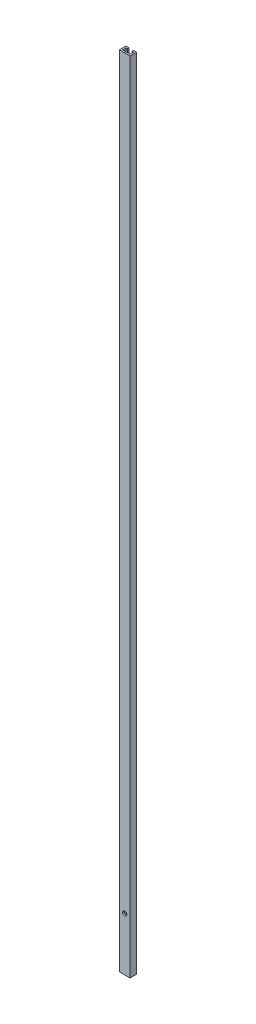
ISO-10303-21;
HEADER;
FILE_DESCRIPTION(('STEP AP214'),'2;1');
FILE_NAME('part.step','',(''),(''),'','','');
FILE_SCHEMA(('AUTOMOTIVE_DESIGN { 1 0 10303 214 1 1 1 1 }'));
ENDSEC;
DATA;
#1=APPLICATION_CONTEXT('core data for automotive mechanical design processes');
#2=APPLICATION_PROTOCOL_DEFINITION('international standard','automotive_design',2000,#1);
#3=PRODUCT_CONTEXT('',#1,'mechanical');
#4=PRODUCT('Part','Part','',(#3));
#5=PRODUCT_RELATED_PRODUCT_CATEGORY('part','',(#4));
#6=PRODUCT_DEFINITION_FORMATION('','',#4);
#7=PRODUCT_DEFINITION_CONTEXT('part definition',#1,'design');
#8=PRODUCT_DEFINITION('design','',#6,#7);
#9=PRODUCT_DEFINITION_SHAPE('','',#8);
#10=(LENGTH_UNIT() NAMED_UNIT(*) SI_UNIT(.MILLI.,.METRE.));
#11=(NAMED_UNIT(*) PLANE_ANGLE_UNIT() SI_UNIT($,.RADIAN.));
#12=(NAMED_UNIT(*) SI_UNIT($,.STERADIAN.) SOLID_ANGLE_UNIT());
#13=UNCERTAINTY_MEASURE_WITH_UNIT(LENGTH_MEASURE(1.E-05),#10,'distance_accuracy_value','');
#14=(GEOMETRIC_REPRESENTATION_CONTEXT(3) GLOBAL_UNCERTAINTY_ASSIGNED_CONTEXT((#13)) GLOBAL_UNIT_ASSIGNED_CONTEXT((#10,
#11,#12)) REPRESENTATION_CONTEXT('',''));
#15=CARTESIAN_POINT('',(0.,0.,0.));
#16=DIRECTION('',(0.,0.,1.));
#17=DIRECTION('',(1.,0.,0.));
#18=AXIS2_PLACEMENT_3D('',#15,#16,#17);
#19=CARTESIAN_POINT('',(0.,600.,0.));
#20=DIRECTION('',(1.,0.,0.));
#21=DIRECTION('',(0.,0.,-1.));
#22=AXIS2_PLACEMENT_3D('',#19,#20,#21);
#23=PLANE('',#22);
#24=DIRECTION('',(0.,0.,1.));
#25=VECTOR('',#24,1.);
#26=CARTESIAN_POINT('',(0.,0.,0.));
#27=LINE('',#26,#25);
#28=CARTESIAN_POINT('',(0.,0.,0.));
#29=VERTEX_POINT('',#28);
#30=CARTESIAN_POINT('',(0.,0.,5.));
#31=VERTEX_POINT('',#30);
#32=EDGE_CURVE('E164',#29,#31,#27,.T.);
#33=ORIENTED_EDGE('',*,*,#32,.T.);
#34=DIRECTION('',(0.,-1.,0.));
#35=VECTOR('',#34,1.);
#36=CARTESIAN_POINT('',(0.,600.,5.));
#37=LINE('',#36,#35);
#38=CARTESIAN_POINT('',(0.,600.,5.));
#39=VERTEX_POINT('',#38);
#40=EDGE_CURVE('E11',#39,#31,#37,.T.);
#41=ORIENTED_EDGE('',*,*,#40,.F.);
#42=DIRECTION('',(0.,0.,1.));
#43=VECTOR('',#42,1.);
#44=CARTESIAN_POINT('',(0.,600.,0.));
#45=LINE('',#44,#43);
#46=CARTESIAN_POINT('',(0.,600.,0.));
#47=VERTEX_POINT('',#46);
#48=EDGE_CURVE('E199',#47,#39,#45,.T.);
#49=ORIENTED_EDGE('',*,*,#48,.F.);
#50=DIRECTION('',(0.,-1.,0.));
#51=VECTOR('',#50,1.);
#52=CARTESIAN_POINT('',(0.,600.,0.));
#53=LINE('',#52,#51);
#54=EDGE_CURVE('E160',#47,#29,#53,.T.);
#55=ORIENTED_EDGE('',*,*,#54,.T.);
#56=EDGE_LOOP('',(#33,#41,#49,#55));
#57=FACE_BOUND('',#56,.T.);
#58=ADVANCED_FACE('F39',(#57),#23,.F.);
#59=CARTESIAN_POINT('',(0.,600.,5.));
#60=DIRECTION('',(0.,0.,-1.));
#61=DIRECTION('',(-1.,0.,0.));
#62=AXIS2_PLACEMENT_3D('',#59,#60,#61);
#63=PLANE('',#62);
#64=CARTESIAN_POINT('',(4.,39.9999999999999,5.));
#65=DIRECTION('',(0.,0.,1.));
#66=DIRECTION('',(1.,0.,0.));
#67=AXIS2_PLACEMENT_3D('',#64,#65,#66);
#68=CIRCLE('',#67,1.6);
#69=CARTESIAN_POINT('',(5.6,39.9999999999999,5.));
#70=VERTEX_POINT('',#69);
#71=EDGE_CURVE('E379',#70,#70,#68,.T.);
#72=ORIENTED_EDGE('',*,*,#71,.F.);
#73=EDGE_LOOP('',(#72));
#74=FACE_BOUND('',#73,.T.);
#75=DIRECTION('',(1.,0.,0.));
#76=VECTOR('',#75,1.);
#77=CARTESIAN_POINT('',(0.,0.,5.));
#78=LINE('',#77,#76);
#79=CARTESIAN_POINT('',(8.,0.,5.));
#80=VERTEX_POINT('',#79);
#81=EDGE_CURVE('E168',#31,#80,#78,.T.);
#82=ORIENTED_EDGE('',*,*,#81,.T.);
#83=DIRECTION('',(0.,-1.,0.));
#84=VECTOR('',#83,1.);
#85=CARTESIAN_POINT('',(8.,600.,5.));
#86=LINE('',#85,#84);
#87=CARTESIAN_POINT('',(8.,600.,5.));
#88=VERTEX_POINT('',#87);
#89=EDGE_CURVE('E48',#88,#80,#86,.T.);
#90=ORIENTED_EDGE('',*,*,#89,.F.);
#91=DIRECTION('',(1.,0.,0.));
#92=VECTOR('',#91,1.);
#93=CARTESIAN_POINT('',(0.,600.,5.));
#94=LINE('',#93,#92);
#95=EDGE_CURVE('E111',#39,#88,#94,.T.);
#96=ORIENTED_EDGE('',*,*,#95,.F.);
#97=ORIENTED_EDGE('',*,*,#40,.T.);
#98=EDGE_LOOP('',(#82,#90,#96,#97));
#99=FACE_BOUND('',#98,.T.);
#100=ADVANCED_FACE('F293',(#74,#99),#63,.F.);
#101=CARTESIAN_POINT('',(8.,600.,5.));
#102=DIRECTION('',(-1.,0.,0.));
#103=DIRECTION('',(0.,0.,1.));
#104=AXIS2_PLACEMENT_3D('',#101,#102,#103);
#105=PLANE('',#104);
#106=DIRECTION('',(0.,0.,-1.));
#107=VECTOR('',#106,1.);
#108=CARTESIAN_POINT('',(8.,0.,5.));
#109=LINE('',#108,#107);
#110=CARTESIAN_POINT('',(8.,0.,0.));
#111=VERTEX_POINT('',#110);
#112=EDGE_CURVE('E172',#80,#111,#109,.T.);
#113=ORIENTED_EDGE('',*,*,#112,.T.);
#114=DIRECTION('',(0.,-1.,0.));
#115=VECTOR('',#114,1.);
#116=CARTESIAN_POINT('',(8.,600.,0.));
#117=LINE('',#116,#115);
#118=CARTESIAN_POINT('',(8.,600.,0.));
#119=VERTEX_POINT('',#118);
#120=EDGE_CURVE('E226',#119,#111,#117,.T.);
#121=ORIENTED_EDGE('',*,*,#120,.F.);
#122=DIRECTION('',(0.,0.,-1.));
#123=VECTOR('',#122,1.);
#124=CARTESIAN_POINT('',(8.,600.,5.));
#125=LINE('',#124,#123);
#126=EDGE_CURVE('E236',#88,#119,#125,.T.);
#127=ORIENTED_EDGE('',*,*,#126,.F.);
#128=ORIENTED_EDGE('',*,*,#89,.T.);
#129=EDGE_LOOP('',(#113,#121,#127,#128));
#130=FACE_BOUND('',#129,.T.);
#131=ADVANCED_FACE('F234',(#130),#105,.F.);
#132=CARTESIAN_POINT('',(8.,600.,0.));
#133=DIRECTION('',(0.,0.,1.));
#134=DIRECTION('',(1.,0.,0.));
#135=AXIS2_PLACEMENT_3D('',#132,#133,#134);
#136=PLANE('',#135);
#137=DIRECTION('',(-1.,0.,0.));
#138=VECTOR('',#137,1.);
#139=CARTESIAN_POINT('',(8.,0.,0.));
#140=LINE('',#139,#138);
#141=CARTESIAN_POINT('',(5.75,0.,0.));
#142=VERTEX_POINT('',#141);
#143=EDGE_CURVE('E175',#111,#142,#140,.T.);
#144=ORIENTED_EDGE('',*,*,#143,.T.);
#145=DIRECTION('',(0.,-1.,0.));
#146=VECTOR('',#145,1.);
#147=CARTESIAN_POINT('',(5.75,600.,0.));
#148=LINE('',#147,#146);
#149=CARTESIAN_POINT('',(5.75,600.,0.));
#150=VERTEX_POINT('',#149);
#151=EDGE_CURVE('E222',#150,#142,#148,.T.);
#152=ORIENTED_EDGE('',*,*,#151,.F.);
#153=DIRECTION('',(-1.,0.,0.));
#154=VECTOR('',#153,1.);
#155=CARTESIAN_POINT('',(8.,600.,0.));
#156=LINE('',#155,#154);
#157=EDGE_CURVE('E255',#119,#150,#156,.T.);
#158=ORIENTED_EDGE('',*,*,#157,.F.);
#159=ORIENTED_EDGE('',*,*,#120,.T.);
#160=EDGE_LOOP('',(#144,#152,#158,#159));
#161=FACE_BOUND('',#160,.T.);
#162=ADVANCED_FACE('F245',(#161),#136,.F.);
#163=CARTESIAN_POINT('',(5.75,600.,0.));
#164=DIRECTION('',(1.,0.,0.));
#165=DIRECTION('',(0.,0.,-1.));
#166=AXIS2_PLACEMENT_3D('',#163,#164,#165);
#167=PLANE('',#166);
#168=DIRECTION('',(0.,0.,1.));
#169=VECTOR('',#168,1.);
#170=CARTESIAN_POINT('',(5.75,0.,0.));
#171=LINE('',#170,#169);
#172=CARTESIAN_POINT('',(5.75,0.,1.15));
#173=VERTEX_POINT('',#172);
#174=EDGE_CURVE('E178',#142,#173,#171,.T.);
#175=ORIENTED_EDGE('',*,*,#174,.T.);
#176=DIRECTION('',(0.,-1.,0.));
#177=VECTOR('',#176,1.);
#178=CARTESIAN_POINT('',(5.75,600.,1.15));
#179=LINE('',#178,#177);
#180=CARTESIAN_POINT('',(5.75,600.,1.15));
#181=VERTEX_POINT('',#180);
#182=EDGE_CURVE('E218',#181,#173,#179,.T.);
#183=ORIENTED_EDGE('',*,*,#182,.F.);
#184=DIRECTION('',(0.,0.,1.));
#185=VECTOR('',#184,1.);
#186=CARTESIAN_POINT('',(5.75,600.,0.));
#187=LINE('',#186,#185);
#188=EDGE_CURVE('E251',#150,#181,#187,.T.);
#189=ORIENTED_EDGE('',*,*,#188,.F.);
#190=ORIENTED_EDGE('',*,*,#151,.T.);
#191=EDGE_LOOP('',(#175,#183,#189,#190));
#192=FACE_BOUND('',#191,.T.);
#193=ADVANCED_FACE('F249',(#192),#167,.F.);
#194=CARTESIAN_POINT('',(5.75,600.,1.15));
#195=DIRECTION('',(0.,0.,-1.));
#196=DIRECTION('',(-1.,0.,0.));
#197=AXIS2_PLACEMENT_3D('',#194,#195,#196);
#198=PLANE('',#197);
#199=DIRECTION('',(1.,0.,0.));
#200=VECTOR('',#199,1.);
#201=CARTESIAN_POINT('',(5.75,0.,1.15));
#202=LINE('',#201,#200);
#203=CARTESIAN_POINT('',(6.85,0.,1.15));
#204=VERTEX_POINT('',#203);
#205=EDGE_CURVE('E181',#173,#204,#202,.T.);
#206=ORIENTED_EDGE('',*,*,#205,.T.);
#207=DIRECTION('',(0.,-1.,0.));
#208=VECTOR('',#207,1.);
#209=CARTESIAN_POINT('',(6.85,600.,1.15));
#210=LINE('',#209,#208);
#211=CARTESIAN_POINT('',(6.85,600.,1.15));
#212=VERTEX_POINT('',#211);
#213=EDGE_CURVE('E214',#212,#204,#210,.T.);
#214=ORIENTED_EDGE('',*,*,#213,.F.);
#215=DIRECTION('',(1.,0.,0.));
#216=VECTOR('',#215,1.);
#217=CARTESIAN_POINT('',(5.75,600.,1.15));
#218=LINE('',#217,#216);
#219=EDGE_CURVE('E254',#181,#212,#218,.T.);
#220=ORIENTED_EDGE('',*,*,#219,.F.);
#221=ORIENTED_EDGE('',*,*,#182,.T.);
#222=EDGE_LOOP('',(#206,#214,#220,#221));
#223=FACE_BOUND('',#222,.T.);
#224=ADVANCED_FACE('F308',(#223),#198,.F.);
#225=CARTESIAN_POINT('',(6.85,600.,1.15));
#226=DIRECTION('',(1.,0.,0.));
#227=DIRECTION('',(0.,0.,-1.));
#228=AXIS2_PLACEMENT_3D('',#225,#226,#227);
#229=PLANE('',#228);
#230=DIRECTION('',(0.,0.,1.));
#231=VECTOR('',#230,1.);
#232=CARTESIAN_POINT('',(6.85,0.,1.15));
#233=LINE('',#232,#231);
#234=CARTESIAN_POINT('',(6.85,0.,3.85));
#235=VERTEX_POINT('',#234);
#236=EDGE_CURVE('E184',#204,#235,#233,.T.);
#237=ORIENTED_EDGE('',*,*,#236,.T.);
#238=DIRECTION('',(0.,-1.,0.));
#239=VECTOR('',#238,1.);
#240=CARTESIAN_POINT('',(6.85,600.,3.85));
#241=LINE('',#240,#239);
#242=CARTESIAN_POINT('',(6.85,600.,3.85));
#243=VERTEX_POINT('',#242);
#244=EDGE_CURVE('E210',#243,#235,#241,.T.);
#245=ORIENTED_EDGE('',*,*,#244,.F.);
#246=DIRECTION('',(0.,0.,1.));
#247=VECTOR('',#246,1.);
#248=CARTESIAN_POINT('',(6.85,600.,1.15));
#249=LINE('',#248,#247);
#250=EDGE_CURVE('E259',#212,#243,#249,.T.);
#251=ORIENTED_EDGE('',*,*,#250,.F.);
#252=ORIENTED_EDGE('',*,*,#213,.T.);
#253=EDGE_LOOP('',(#237,#245,#251,#252));
#254=FACE_BOUND('',#253,.T.);
#255=ADVANCED_FACE('F311',(#254),#229,.F.);
#256=CARTESIAN_POINT('',(6.85,600.,3.85));
#257=DIRECTION('',(0.,0.,1.));
#258=DIRECTION('',(1.,0.,0.));
#259=AXIS2_PLACEMENT_3D('',#256,#257,#258);
#260=PLANE('',#259);
#261=CARTESIAN_POINT('',(4.,39.9999999999999,3.85));
#262=DIRECTION('',(0.,0.,1.));
#263=DIRECTION('',(1.,0.,0.));
#264=AXIS2_PLACEMENT_3D('',#261,#262,#263);
#265=CIRCLE('',#264,1.6);
#266=CARTESIAN_POINT('',(5.6,39.9999999999999,3.85));
#267=VERTEX_POINT('',#266);
#268=EDGE_CURVE('E169',#267,#267,#265,.F.);
#269=ORIENTED_EDGE('',*,*,#268,.F.);
#270=EDGE_LOOP('',(#269));
#271=FACE_BOUND('',#270,.T.);
#272=DIRECTION('',(-1.,0.,0.));
#273=VECTOR('',#272,1.);
#274=CARTESIAN_POINT('',(6.85,0.,3.85));
#275=LINE('',#274,#273);
#276=CARTESIAN_POINT('',(1.15,0.,3.85));
#277=VERTEX_POINT('',#276);
#278=EDGE_CURVE('E187',#235,#277,#275,.T.);
#279=ORIENTED_EDGE('',*,*,#278,.T.);
#280=DIRECTION('',(0.,-1.,0.));
#281=VECTOR('',#280,1.);
#282=CARTESIAN_POINT('',(1.15,600.,3.85));
#283=LINE('',#282,#281);
#284=CARTESIAN_POINT('',(1.15,600.,3.85));
#285=VERTEX_POINT('',#284);
#286=EDGE_CURVE('E206',#285,#277,#283,.T.);
#287=ORIENTED_EDGE('',*,*,#286,.F.);
#288=DIRECTION('',(-1.,0.,0.));
#289=VECTOR('',#288,1.);
#290=CARTESIAN_POINT('',(6.85,600.,3.85));
#291=LINE('',#290,#289);
#292=EDGE_CURVE('E266',#243,#285,#291,.T.);
#293=ORIENTED_EDGE('',*,*,#292,.F.);
#294=ORIENTED_EDGE('',*,*,#244,.T.);
#295=EDGE_LOOP('',(#279,#287,#293,#294));
#296=FACE_BOUND('',#295,.T.);
#297=ADVANCED_FACE('F274',(#271,#296),#260,.F.);
#298=CARTESIAN_POINT('',(1.15,600.,3.85));
#299=DIRECTION('',(-1.,0.,0.));
#300=DIRECTION('',(0.,0.,1.));
#301=AXIS2_PLACEMENT_3D('',#298,#299,#300);
#302=PLANE('',#301);
#303=DIRECTION('',(0.,0.,-1.));
#304=VECTOR('',#303,1.);
#305=CARTESIAN_POINT('',(1.15,0.,3.85));
#306=LINE('',#305,#304);
#307=CARTESIAN_POINT('',(1.15,0.,1.15));
#308=VERTEX_POINT('',#307);
#309=EDGE_CURVE('E190',#277,#308,#306,.T.);
#310=ORIENTED_EDGE('',*,*,#309,.T.);
#311=DIRECTION('',(0.,-1.,0.));
#312=VECTOR('',#311,1.);
#313=CARTESIAN_POINT('',(1.15,600.,1.15));
#314=LINE('',#313,#312);
#315=CARTESIAN_POINT('',(1.15,600.,1.15));
#316=VERTEX_POINT('',#315);
#317=EDGE_CURVE('E153',#316,#308,#314,.T.);
#318=ORIENTED_EDGE('',*,*,#317,.F.);
#319=DIRECTION('',(0.,0.,-1.));
#320=VECTOR('',#319,1.);
#321=CARTESIAN_POINT('',(1.15,600.,3.85));
#322=LINE('',#321,#320);
#323=EDGE_CURVE('E142',#285,#316,#322,.T.);
#324=ORIENTED_EDGE('',*,*,#323,.F.);
#325=ORIENTED_EDGE('',*,*,#286,.T.);
#326=EDGE_LOOP('',(#310,#318,#324,#325));
#327=FACE_BOUND('',#326,.T.);
#328=ADVANCED_FACE('F278',(#327),#302,.F.);
#329=CARTESIAN_POINT('',(1.15,600.,1.15));
#330=DIRECTION('',(0.,0.,-1.));
#331=DIRECTION('',(-1.,0.,0.));
#332=AXIS2_PLACEMENT_3D('',#329,#330,#331);
#333=PLANE('',#332);
#334=DIRECTION('',(1.,0.,0.));
#335=VECTOR('',#334,1.);
#336=CARTESIAN_POINT('',(1.15,0.,1.15));
#337=LINE('',#336,#335);
#338=CARTESIAN_POINT('',(2.25,0.,1.15));
#339=VERTEX_POINT('',#338);
#340=EDGE_CURVE('E151',#308,#339,#337,.T.);
#341=ORIENTED_EDGE('',*,*,#340,.T.);
#342=DIRECTION('',(0.,-1.,0.));
#343=VECTOR('',#342,1.);
#344=CARTESIAN_POINT('',(2.25,600.,1.15));
#345=LINE('',#344,#343);
#346=CARTESIAN_POINT('',(2.25,600.,1.15));
#347=VERTEX_POINT('',#346);
#348=EDGE_CURVE('E148',#347,#339,#345,.T.);
#349=ORIENTED_EDGE('',*,*,#348,.F.);
#350=DIRECTION('',(1.,0.,0.));
#351=VECTOR('',#350,1.);
#352=CARTESIAN_POINT('',(1.15,600.,1.15));
#353=LINE('',#352,#351);
#354=EDGE_CURVE('E136',#316,#347,#353,.T.);
#355=ORIENTED_EDGE('',*,*,#354,.F.);
#356=ORIENTED_EDGE('',*,*,#317,.T.);
#357=EDGE_LOOP('',(#341,#349,#355,#356));
#358=FACE_BOUND('',#357,.T.);
#359=ADVANCED_FACE('F149',(#358),#333,.F.);
#360=CARTESIAN_POINT('',(2.25,600.,1.15));
#361=DIRECTION('',(-1.,0.,0.));
#362=DIRECTION('',(0.,0.,1.));
#363=AXIS2_PLACEMENT_3D('',#360,#361,#362);
#364=PLANE('',#363);
#365=DIRECTION('',(0.,0.,-1.));
#366=VECTOR('',#365,1.);
#367=CARTESIAN_POINT('',(2.25,0.,1.15));
#368=LINE('',#367,#366);
#369=CARTESIAN_POINT('',(2.25,0.,0.));
#370=VERTEX_POINT('',#369);
#371=EDGE_CURVE('E97',#339,#370,#368,.T.);
#372=ORIENTED_EDGE('',*,*,#371,.T.);
#373=DIRECTION('',(0.,-1.,0.));
#374=VECTOR('',#373,1.);
#375=CARTESIAN_POINT('',(2.25,600.,0.));
#376=LINE('',#375,#374);
#377=CARTESIAN_POINT('',(2.25,600.,0.));
#378=VERTEX_POINT('',#377);
#379=EDGE_CURVE('E154',#378,#370,#376,.T.);
#380=ORIENTED_EDGE('',*,*,#379,.F.);
#381=DIRECTION('',(0.,0.,-1.));
#382=VECTOR('',#381,1.);
#383=CARTESIAN_POINT('',(2.25,600.,1.15));
#384=LINE('',#383,#382);
#385=EDGE_CURVE('E140',#347,#378,#384,.T.);
#386=ORIENTED_EDGE('',*,*,#385,.F.);
#387=ORIENTED_EDGE('',*,*,#348,.T.);
#388=EDGE_LOOP('',(#372,#380,#386,#387));
#389=FACE_BOUND('',#388,.T.);
#390=ADVANCED_FACE('F156',(#389),#364,.F.);
#391=CARTESIAN_POINT('',(2.25,600.,0.));
#392=DIRECTION('',(0.,0.,1.));
#393=DIRECTION('',(1.,0.,0.));
#394=AXIS2_PLACEMENT_3D('',#391,#392,#393);
#395=PLANE('',#394);
#396=DIRECTION('',(-1.,0.,0.));
#397=VECTOR('',#396,1.);
#398=CARTESIAN_POINT('',(2.25,0.,0.));
#399=LINE('',#398,#397);
#400=EDGE_CURVE('E103',#370,#29,#399,.T.);
#401=ORIENTED_EDGE('',*,*,#400,.T.);
#402=ORIENTED_EDGE('',*,*,#54,.F.);
#403=DIRECTION('',(-1.,0.,0.));
#404=VECTOR('',#403,1.);
#405=CARTESIAN_POINT('',(2.25,600.,0.));
#406=LINE('',#405,#404);
#407=EDGE_CURVE('E56',#378,#47,#406,.T.);
#408=ORIENTED_EDGE('',*,*,#407,.F.);
#409=ORIENTED_EDGE('',*,*,#379,.T.);
#410=EDGE_LOOP('',(#401,#402,#408,#409));
#411=FACE_BOUND('',#410,.T.);
#412=ADVANCED_FACE('F282',(#411),#395,.F.);
#413=CARTESIAN_POINT('',(0.,600.,0.));
#414=DIRECTION('',(0.,1.,0.));
#415=DIRECTION('',(0.,0.,1.));
#416=AXIS2_PLACEMENT_3D('',#413,#414,#415);
#417=PLANE('',#416);
#418=ORIENTED_EDGE('',*,*,#48,.T.);
#419=ORIENTED_EDGE('',*,*,#95,.T.);
#420=ORIENTED_EDGE('',*,*,#126,.T.);
#421=ORIENTED_EDGE('',*,*,#157,.T.);
#422=ORIENTED_EDGE('',*,*,#188,.T.);
#423=ORIENTED_EDGE('',*,*,#219,.T.);
#424=ORIENTED_EDGE('',*,*,#250,.T.);
#425=ORIENTED_EDGE('',*,*,#292,.T.);
#426=ORIENTED_EDGE('',*,*,#323,.T.);
#427=ORIENTED_EDGE('',*,*,#354,.T.);
#428=ORIENTED_EDGE('',*,*,#385,.T.);
#429=ORIENTED_EDGE('',*,*,#407,.T.);
#430=EDGE_LOOP('',(#418,#419,#420,#421,#422,#423,#424,#425,#426,#427,#428,#429));
#431=FACE_BOUND('',#430,.T.);
#432=ADVANCED_FACE('F138',(#431),#417,.T.);
#433=CARTESIAN_POINT('',(0.,0.,0.));
#434=DIRECTION('',(0.,1.,0.));
#435=DIRECTION('',(0.,0.,1.));
#436=AXIS2_PLACEMENT_3D('',#433,#434,#435);
#437=PLANE('',#436);
#438=ORIENTED_EDGE('',*,*,#32,.F.);
#439=ORIENTED_EDGE('',*,*,#400,.F.);
#440=ORIENTED_EDGE('',*,*,#371,.F.);
#441=ORIENTED_EDGE('',*,*,#340,.F.);
#442=ORIENTED_EDGE('',*,*,#309,.F.);
#443=ORIENTED_EDGE('',*,*,#278,.F.);
#444=ORIENTED_EDGE('',*,*,#236,.F.);
#445=ORIENTED_EDGE('',*,*,#205,.F.);
#446=ORIENTED_EDGE('',*,*,#174,.F.);
#447=ORIENTED_EDGE('',*,*,#143,.F.);
#448=ORIENTED_EDGE('',*,*,#112,.F.);
#449=ORIENTED_EDGE('',*,*,#81,.F.);
#450=EDGE_LOOP('',(#438,#439,#440,#441,#442,#443,#444,#445,#446,#447,#448,#449));
#451=FACE_BOUND('',#450,.T.);
#452=ADVANCED_FACE('F240',(#451),#437,.F.);
#453=CARTESIAN_POINT('',(4.,39.9999999999999,-0.675483399593915));
#454=DIRECTION('',(0.,0.,1.));
#455=DIRECTION('',(1.,0.,0.));
#456=AXIS2_PLACEMENT_3D('',#453,#454,#455);
#457=CYLINDRICAL_SURFACE('',#456,1.6);
#458=ORIENTED_EDGE('',*,*,#268,.T.);
#459=EDGE_LOOP('',(#458));
#460=FACE_BOUND('',#459,.T.);
#461=ORIENTED_EDGE('',*,*,#71,.T.);
#462=EDGE_LOOP('',(#461));
#463=FACE_BOUND('',#462,.T.);
#464=ADVANCED_FACE('F348',(#460,#463),#457,.F.);
#465=CLOSED_SHELL('',(#58,#100,#131,#162,#193,#224,#255,#297,#328,#359,#390,#412,#432,#452,#464));
#466=MANIFOLD_SOLID_BREP('B2',#465);
#467=ADVANCED_BREP_SHAPE_REPRESENTATION('',(#18,#466),#14);
#468=SHAPE_DEFINITION_REPRESENTATION(#9,#467);
ENDSEC;
END-ISO-10303-21;
